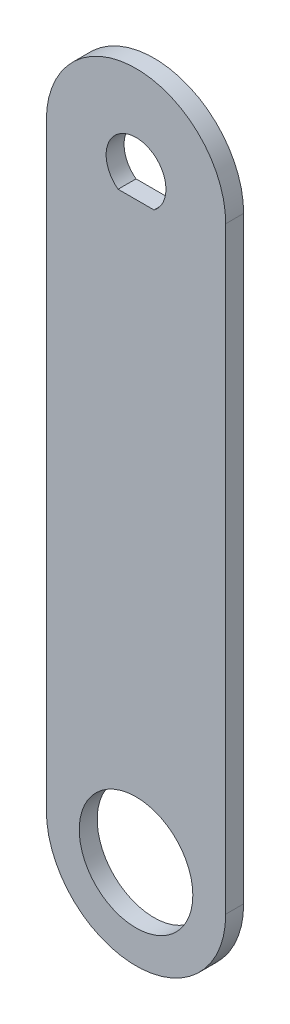
ISO-10303-21;
HEADER;
FILE_DESCRIPTION(('STEP AP214'),'2;1');
FILE_NAME('part.step','',(''),(''),'','','');
FILE_SCHEMA(('AUTOMOTIVE_DESIGN { 1 0 10303 214 1 1 1 1 }'));
ENDSEC;
DATA;
#1=APPLICATION_CONTEXT('core data for automotive mechanical design processes');
#2=APPLICATION_PROTOCOL_DEFINITION('international standard','automotive_design',2000,#1);
#3=PRODUCT_CONTEXT('',#1,'mechanical');
#4=PRODUCT('Part','Part','',(#3));
#5=PRODUCT_RELATED_PRODUCT_CATEGORY('part','',(#4));
#6=PRODUCT_DEFINITION_FORMATION('','',#4);
#7=PRODUCT_DEFINITION_CONTEXT('part definition',#1,'design');
#8=PRODUCT_DEFINITION('design','',#6,#7);
#9=PRODUCT_DEFINITION_SHAPE('','',#8);
#10=(LENGTH_UNIT() NAMED_UNIT(*) SI_UNIT(.MILLI.,.METRE.));
#11=(NAMED_UNIT(*) PLANE_ANGLE_UNIT() SI_UNIT($,.RADIAN.));
#12=(NAMED_UNIT(*) SI_UNIT($,.STERADIAN.) SOLID_ANGLE_UNIT());
#13=UNCERTAINTY_MEASURE_WITH_UNIT(LENGTH_MEASURE(1.E-05),#10,'distance_accuracy_value','');
#14=(GEOMETRIC_REPRESENTATION_CONTEXT(3) GLOBAL_UNCERTAINTY_ASSIGNED_CONTEXT((#13)) GLOBAL_UNIT_ASSIGNED_CONTEXT((#10,
#11,#12)) REPRESENTATION_CONTEXT('',''));
#15=CARTESIAN_POINT('',(0.,0.,0.));
#16=DIRECTION('',(0.,0.,1.));
#17=DIRECTION('',(1.,0.,0.));
#18=AXIS2_PLACEMENT_3D('',#15,#16,#17);
#19=CARTESIAN_POINT('',(0.,0.,3.));
#20=DIRECTION('',(0.,0.,1.));
#21=DIRECTION('',(1.,0.,0.));
#22=AXIS2_PLACEMENT_3D('',#19,#20,#21);
#23=PLANE('',#22);
#24=CARTESIAN_POINT('',(0.,0.,3.));
#25=DIRECTION('',(0.,0.,1.));
#26=DIRECTION('',(1.,0.,0.));
#27=AXIS2_PLACEMENT_3D('',#24,#25,#26);
#28=CIRCLE('',#27,15.);
#29=CARTESIAN_POINT('',(15.,0.,3.));
#30=VERTEX_POINT('',#29);
#31=CARTESIAN_POINT('',(-15.,0.,3.));
#32=VERTEX_POINT('',#31);
#33=EDGE_CURVE('E123',#30,#32,#28,.T.);
#34=ORIENTED_EDGE('',*,*,#33,.T.);
#35=DIRECTION('',(0.,-1.,0.));
#36=VECTOR('',#35,1.);
#37=CARTESIAN_POINT('',(-15.,0.,3.));
#38=LINE('',#37,#36);
#39=CARTESIAN_POINT('',(-15.,-100.,3.));
#40=VERTEX_POINT('',#39);
#41=EDGE_CURVE('E127',#32,#40,#38,.T.);
#42=ORIENTED_EDGE('',*,*,#41,.T.);
#43=CARTESIAN_POINT('',(0.,-100.,3.));
#44=DIRECTION('',(0.,0.,1.));
#45=DIRECTION('',(1.,0.,0.));
#46=AXIS2_PLACEMENT_3D('',#43,#44,#45);
#47=CIRCLE('',#46,15.);
#48=CARTESIAN_POINT('',(15.,-100.,3.));
#49=VERTEX_POINT('',#48);
#50=EDGE_CURVE('E131',#40,#49,#47,.T.);
#51=ORIENTED_EDGE('',*,*,#50,.T.);
#52=DIRECTION('',(0.,1.,0.));
#53=VECTOR('',#52,1.);
#54=CARTESIAN_POINT('',(15.,0.,3.));
#55=LINE('',#54,#53);
#56=EDGE_CURVE('E134',#49,#30,#55,.T.);
#57=ORIENTED_EDGE('',*,*,#56,.T.);
#58=EDGE_LOOP('',(#34,#42,#51,#57));
#59=FACE_BOUND('',#58,.T.);
#60=CARTESIAN_POINT('',(0.,-100.,3.));
#61=DIRECTION('',(0.,0.,1.));
#62=DIRECTION('',(1.,0.,0.));
#63=AXIS2_PLACEMENT_3D('',#60,#61,#62);
#64=CIRCLE('',#63,9.49999999999999);
#65=CARTESIAN_POINT('',(9.49999999999999,-100.,3.));
#66=VERTEX_POINT('',#65);
#67=EDGE_CURVE('E115',#66,#66,#64,.T.);
#68=ORIENTED_EDGE('',*,*,#67,.F.);
#69=EDGE_LOOP('',(#68));
#70=FACE_BOUND('',#69,.T.);
#71=DIRECTION('',(1.,0.,0.));
#72=VECTOR('',#71,1.);
#73=CARTESIAN_POINT('',(0.,-4.,3.));
#74=LINE('',#73,#72);
#75=CARTESIAN_POINT('',(-3.,-4.,3.));
#76=VERTEX_POINT('',#75);
#77=CARTESIAN_POINT('',(3.,-4.,3.));
#78=VERTEX_POINT('',#77);
#79=EDGE_CURVE('E92',#76,#78,#74,.T.);
#80=ORIENTED_EDGE('',*,*,#79,.F.);
#81=CARTESIAN_POINT('',(0.,0.,3.));
#82=DIRECTION('',(0.,0.,1.));
#83=DIRECTION('',(1.,0.,0.));
#84=AXIS2_PLACEMENT_3D('',#81,#82,#83);
#85=CIRCLE('',#84,5.);
#86=EDGE_CURVE('E99',#78,#76,#85,.T.);
#87=ORIENTED_EDGE('',*,*,#86,.F.);
#88=EDGE_LOOP('',(#80,#87));
#89=FACE_BOUND('',#88,.T.);
#90=ADVANCED_FACE('F39',(#59,#70,#89),#23,.T.);
#91=CARTESIAN_POINT('',(0.,0.,0.));
#92=DIRECTION('',(0.,0.,1.));
#93=DIRECTION('',(1.,0.,0.));
#94=AXIS2_PLACEMENT_3D('',#91,#92,#93);
#95=PLANE('',#94);
#96=CARTESIAN_POINT('',(0.,-100.,0.));
#97=DIRECTION('',(0.,0.,1.));
#98=DIRECTION('',(1.,0.,0.));
#99=AXIS2_PLACEMENT_3D('',#96,#97,#98);
#100=CIRCLE('',#99,9.49999999999999);
#101=CARTESIAN_POINT('',(9.49999999999999,-100.,0.));
#102=VERTEX_POINT('',#101);
#103=EDGE_CURVE('E114',#102,#102,#100,.T.);
#104=ORIENTED_EDGE('',*,*,#103,.T.);
#105=EDGE_LOOP('',(#104));
#106=FACE_BOUND('',#105,.T.);
#107=CARTESIAN_POINT('',(0.,0.,0.));
#108=DIRECTION('',(0.,0.,1.));
#109=DIRECTION('',(1.,0.,0.));
#110=AXIS2_PLACEMENT_3D('',#107,#108,#109);
#111=CIRCLE('',#110,15.);
#112=CARTESIAN_POINT('',(15.,0.,0.));
#113=VERTEX_POINT('',#112);
#114=CARTESIAN_POINT('',(-15.,0.,0.));
#115=VERTEX_POINT('',#114);
#116=EDGE_CURVE('E119',#113,#115,#111,.T.);
#117=ORIENTED_EDGE('',*,*,#116,.F.);
#118=DIRECTION('',(0.,1.,0.));
#119=VECTOR('',#118,1.);
#120=CARTESIAN_POINT('',(15.,0.,0.));
#121=LINE('',#120,#119);
#122=CARTESIAN_POINT('',(15.,-100.,0.));
#123=VERTEX_POINT('',#122);
#124=EDGE_CURVE('E128',#123,#113,#121,.T.);
#125=ORIENTED_EDGE('',*,*,#124,.F.);
#126=CARTESIAN_POINT('',(0.,-100.,0.));
#127=DIRECTION('',(0.,0.,1.));
#128=DIRECTION('',(1.,0.,0.));
#129=AXIS2_PLACEMENT_3D('',#126,#127,#128);
#130=CIRCLE('',#129,15.);
#131=CARTESIAN_POINT('',(-15.,-100.,0.));
#132=VERTEX_POINT('',#131);
#133=EDGE_CURVE('E144',#132,#123,#130,.T.);
#134=ORIENTED_EDGE('',*,*,#133,.F.);
#135=DIRECTION('',(0.,-1.,0.));
#136=VECTOR('',#135,1.);
#137=CARTESIAN_POINT('',(-15.,0.,0.));
#138=LINE('',#137,#136);
#139=EDGE_CURVE('E141',#115,#132,#138,.T.);
#140=ORIENTED_EDGE('',*,*,#139,.F.);
#141=EDGE_LOOP('',(#117,#125,#134,#140));
#142=FACE_BOUND('',#141,.T.);
#143=CARTESIAN_POINT('',(0.,0.,0.));
#144=DIRECTION('',(0.,0.,1.));
#145=DIRECTION('',(1.,0.,0.));
#146=AXIS2_PLACEMENT_3D('',#143,#144,#145);
#147=CIRCLE('',#146,5.);
#148=CARTESIAN_POINT('',(3.,-4.,0.));
#149=VERTEX_POINT('',#148);
#150=CARTESIAN_POINT('',(-3.,-4.,0.));
#151=VERTEX_POINT('',#150);
#152=EDGE_CURVE('E62',#149,#151,#147,.T.);
#153=ORIENTED_EDGE('',*,*,#152,.T.);
#154=DIRECTION('',(1.,0.,0.));
#155=VECTOR('',#154,1.);
#156=CARTESIAN_POINT('',(0.,-4.,0.));
#157=LINE('',#156,#155);
#158=EDGE_CURVE('E105',#151,#149,#157,.T.);
#159=ORIENTED_EDGE('',*,*,#158,.T.);
#160=EDGE_LOOP('',(#153,#159));
#161=FACE_BOUND('',#160,.T.);
#162=ADVANCED_FACE('F167',(#106,#142,#161),#95,.F.);
#163=CARTESIAN_POINT('',(0.,0.,3.));
#164=DIRECTION('',(0.,0.,-1.));
#165=DIRECTION('',(-1.,0.,0.));
#166=AXIS2_PLACEMENT_3D('',#163,#164,#165);
#167=CYLINDRICAL_SURFACE('',#166,15.);
#168=ORIENTED_EDGE('',*,*,#116,.T.);
#169=DIRECTION('',(0.,0.,-1.));
#170=VECTOR('',#169,1.);
#171=CARTESIAN_POINT('',(-15.,0.,3.));
#172=LINE('',#171,#170);
#173=EDGE_CURVE('E11',#32,#115,#172,.T.);
#174=ORIENTED_EDGE('',*,*,#173,.F.);
#175=ORIENTED_EDGE('',*,*,#33,.F.);
#176=DIRECTION('',(0.,0.,-1.));
#177=VECTOR('',#176,1.);
#178=CARTESIAN_POINT('',(15.,0.,3.));
#179=LINE('',#178,#177);
#180=EDGE_CURVE('E137',#30,#113,#179,.T.);
#181=ORIENTED_EDGE('',*,*,#180,.T.);
#182=EDGE_LOOP('',(#168,#174,#175,#181));
#183=FACE_BOUND('',#182,.T.);
#184=ADVANCED_FACE('F41',(#183),#167,.T.);
#185=CARTESIAN_POINT('',(-15.,0.,3.));
#186=DIRECTION('',(1.,0.,0.));
#187=DIRECTION('',(0.,0.,-1.));
#188=AXIS2_PLACEMENT_3D('',#185,#186,#187);
#189=PLANE('',#188);
#190=ORIENTED_EDGE('',*,*,#139,.T.);
#191=DIRECTION('',(0.,0.,-1.));
#192=VECTOR('',#191,1.);
#193=CARTESIAN_POINT('',(-15.,-100.,3.));
#194=LINE('',#193,#192);
#195=EDGE_CURVE('E48',#40,#132,#194,.T.);
#196=ORIENTED_EDGE('',*,*,#195,.F.);
#197=ORIENTED_EDGE('',*,*,#41,.F.);
#198=ORIENTED_EDGE('',*,*,#173,.T.);
#199=EDGE_LOOP('',(#190,#196,#197,#198));
#200=FACE_BOUND('',#199,.T.);
#201=ADVANCED_FACE('F178',(#200),#189,.F.);
#202=CARTESIAN_POINT('',(0.,-100.,3.));
#203=DIRECTION('',(0.,0.,-1.));
#204=DIRECTION('',(-1.,0.,0.));
#205=AXIS2_PLACEMENT_3D('',#202,#203,#204);
#206=CYLINDRICAL_SURFACE('',#205,15.);
#207=ORIENTED_EDGE('',*,*,#133,.T.);
#208=DIRECTION('',(0.,0.,-1.));
#209=VECTOR('',#208,1.);
#210=CARTESIAN_POINT('',(15.,-100.,3.));
#211=LINE('',#210,#209);
#212=EDGE_CURVE('E152',#49,#123,#211,.T.);
#213=ORIENTED_EDGE('',*,*,#212,.F.);
#214=ORIENTED_EDGE('',*,*,#50,.F.);
#215=ORIENTED_EDGE('',*,*,#195,.T.);
#216=EDGE_LOOP('',(#207,#213,#214,#215));
#217=FACE_BOUND('',#216,.T.);
#218=ADVANCED_FACE('F161',(#217),#206,.T.);
#219=CARTESIAN_POINT('',(15.,0.,3.));
#220=DIRECTION('',(-1.,0.,0.));
#221=DIRECTION('',(0.,0.,1.));
#222=AXIS2_PLACEMENT_3D('',#219,#220,#221);
#223=PLANE('',#222);
#224=ORIENTED_EDGE('',*,*,#124,.T.);
#225=ORIENTED_EDGE('',*,*,#180,.F.);
#226=ORIENTED_EDGE('',*,*,#56,.F.);
#227=ORIENTED_EDGE('',*,*,#212,.T.);
#228=EDGE_LOOP('',(#224,#225,#226,#227));
#229=FACE_BOUND('',#228,.T.);
#230=ADVANCED_FACE('F171',(#229),#223,.F.);
#231=CARTESIAN_POINT('',(0.,-100.,3.));
#232=DIRECTION('',(0.,0.,-1.));
#233=DIRECTION('',(-1.,0.,0.));
#234=AXIS2_PLACEMENT_3D('',#231,#232,#233);
#235=CYLINDRICAL_SURFACE('',#234,9.49999999999999);
#236=ORIENTED_EDGE('',*,*,#67,.T.);
#237=EDGE_LOOP('',(#236));
#238=FACE_BOUND('',#237,.T.);
#239=ORIENTED_EDGE('',*,*,#103,.F.);
#240=EDGE_LOOP('',(#239));
#241=FACE_BOUND('',#240,.T.);
#242=ADVANCED_FACE('F193',(#238,#241),#235,.F.);
#243=CARTESIAN_POINT('',(0.,0.,3.));
#244=DIRECTION('',(0.,0.,-1.));
#245=DIRECTION('',(-1.,0.,0.));
#246=AXIS2_PLACEMENT_3D('',#243,#244,#245);
#247=CYLINDRICAL_SURFACE('',#246,5.);
#248=ORIENTED_EDGE('',*,*,#152,.F.);
#249=DIRECTION('',(0.,0.,-1.));
#250=VECTOR('',#249,1.);
#251=CARTESIAN_POINT('',(3.,-4.,3.));
#252=LINE('',#251,#250);
#253=EDGE_CURVE('E94',#78,#149,#252,.T.);
#254=ORIENTED_EDGE('',*,*,#253,.F.);
#255=ORIENTED_EDGE('',*,*,#86,.T.);
#256=DIRECTION('',(0.,0.,-1.));
#257=VECTOR('',#256,1.);
#258=CARTESIAN_POINT('',(-3.,-4.,3.));
#259=LINE('',#258,#257);
#260=EDGE_CURVE('E55',#76,#151,#259,.T.);
#261=ORIENTED_EDGE('',*,*,#260,.T.);
#262=EDGE_LOOP('',(#248,#254,#255,#261));
#263=FACE_BOUND('',#262,.T.);
#264=ADVANCED_FACE('F101',(#263),#247,.F.);
#265=CARTESIAN_POINT('',(0.,-4.,3.));
#266=DIRECTION('',(0.,1.,0.));
#267=DIRECTION('',(0.,0.,1.));
#268=AXIS2_PLACEMENT_3D('',#265,#266,#267);
#269=PLANE('',#268);
#270=ORIENTED_EDGE('',*,*,#158,.F.);
#271=ORIENTED_EDGE('',*,*,#260,.F.);
#272=ORIENTED_EDGE('',*,*,#79,.T.);
#273=ORIENTED_EDGE('',*,*,#253,.T.);
#274=EDGE_LOOP('',(#270,#271,#272,#273));
#275=FACE_BOUND('',#274,.T.);
#276=ADVANCED_FACE('F93',(#275),#269,.T.);
#277=CLOSED_SHELL('',(#90,#162,#184,#201,#218,#230,#242,#264,#276));
#278=MANIFOLD_SOLID_BREP('B2',#277);
#279=ADVANCED_BREP_SHAPE_REPRESENTATION('',(#18,#278),#14);
#280=SHAPE_DEFINITION_REPRESENTATION(#9,#279);
ENDSEC;
END-ISO-10303-21;
